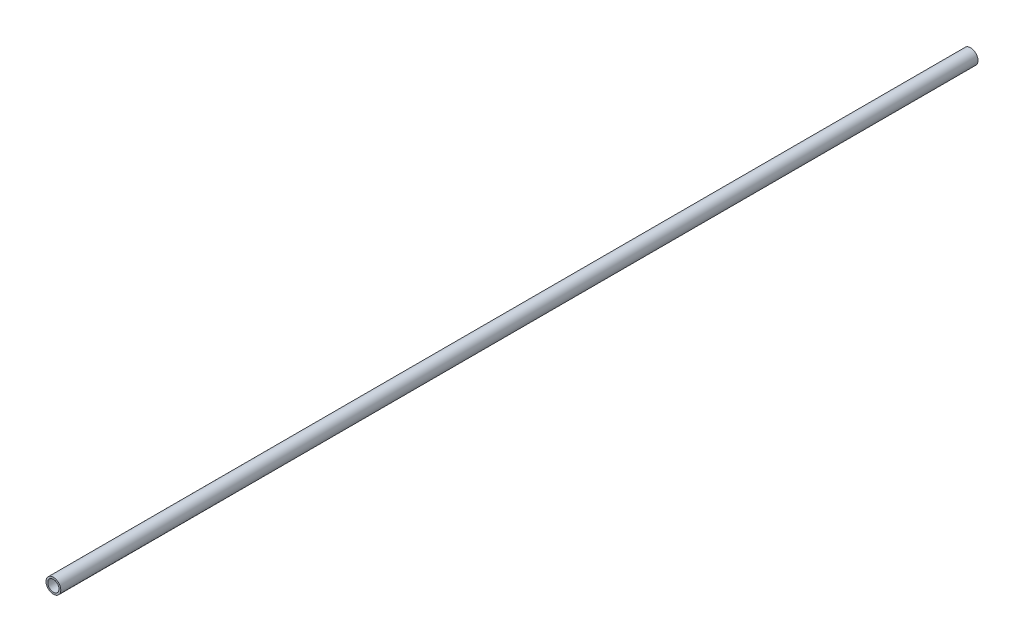
ISO-10303-21;
HEADER;
FILE_DESCRIPTION(('STEP AP214'),'2;1');
FILE_NAME('part.step','',(''),(''),'','','');
FILE_SCHEMA(('AUTOMOTIVE_DESIGN { 1 0 10303 214 1 1 1 1 }'));
ENDSEC;
DATA;
#1=APPLICATION_CONTEXT('core data for automotive mechanical design processes');
#2=APPLICATION_PROTOCOL_DEFINITION('international standard','automotive_design',2000,#1);
#3=PRODUCT_CONTEXT('',#1,'mechanical');
#4=PRODUCT('Part','Part','',(#3));
#5=PRODUCT_RELATED_PRODUCT_CATEGORY('part','',(#4));
#6=PRODUCT_DEFINITION_FORMATION('','',#4);
#7=PRODUCT_DEFINITION_CONTEXT('part definition',#1,'design');
#8=PRODUCT_DEFINITION('design','',#6,#7);
#9=PRODUCT_DEFINITION_SHAPE('','',#8);
#10=(LENGTH_UNIT() NAMED_UNIT(*) SI_UNIT(.MILLI.,.METRE.));
#11=(NAMED_UNIT(*) PLANE_ANGLE_UNIT() SI_UNIT($,.RADIAN.));
#12=(NAMED_UNIT(*) SI_UNIT($,.STERADIAN.) SOLID_ANGLE_UNIT());
#13=UNCERTAINTY_MEASURE_WITH_UNIT(LENGTH_MEASURE(1.E-05),#10,'distance_accuracy_value','');
#14=(GEOMETRIC_REPRESENTATION_CONTEXT(3) GLOBAL_UNCERTAINTY_ASSIGNED_CONTEXT((#13)) GLOBAL_UNIT_ASSIGNED_CONTEXT((#10,
#11,#12)) REPRESENTATION_CONTEXT('',''));
#15=CARTESIAN_POINT('',(0.,0.,0.));
#16=DIRECTION('',(0.,0.,1.));
#17=DIRECTION('',(1.,0.,0.));
#18=AXIS2_PLACEMENT_3D('',#15,#16,#17);
#19=CARTESIAN_POINT('',(0.,0.,2072.386));
#20=DIRECTION('',(0.,0.,1.));
#21=DIRECTION('',(1.,0.,0.));
#22=AXIS2_PLACEMENT_3D('',#19,#20,#21);
#23=PLANE('',#22);
#24=CARTESIAN_POINT('',(0.,0.,2072.386));
#25=DIRECTION('',(0.,0.,1.));
#26=DIRECTION('',(1.,0.,0.));
#27=AXIS2_PLACEMENT_3D('',#24,#25,#26);
#28=CIRCLE('',#27,16.7005);
#29=CARTESIAN_POINT('',(16.7005,0.,2072.386));
#30=VERTEX_POINT('',#29);
#31=EDGE_CURVE('E10',#30,#30,#28,.T.);
#32=ORIENTED_EDGE('',*,*,#31,.T.);
#33=EDGE_LOOP('',(#32));
#34=FACE_BOUND('',#33,.T.);
#35=CARTESIAN_POINT('',(0.,0.,2072.386));
#36=DIRECTION('',(0.,0.,1.));
#37=DIRECTION('',(1.,0.,0.));
#38=AXIS2_PLACEMENT_3D('',#35,#36,#37);
#39=CIRCLE('',#38,12.7);
#40=CARTESIAN_POINT('',(12.7,0.,2072.386));
#41=VERTEX_POINT('',#40);
#42=EDGE_CURVE('E44',#41,#41,#39,.T.);
#43=ORIENTED_EDGE('',*,*,#42,.F.);
#44=EDGE_LOOP('',(#43));
#45=FACE_BOUND('',#44,.T.);
#46=ADVANCED_FACE('F33',(#34,#45),#23,.T.);
#47=CARTESIAN_POINT('',(0.,0.,0.));
#48=DIRECTION('',(0.,0.,1.));
#49=DIRECTION('',(1.,0.,0.));
#50=AXIS2_PLACEMENT_3D('',#47,#48,#49);
#51=PLANE('',#50);
#52=CARTESIAN_POINT('',(0.,0.,0.));
#53=DIRECTION('',(0.,0.,1.));
#54=DIRECTION('',(1.,0.,0.));
#55=AXIS2_PLACEMENT_3D('',#52,#53,#54);
#56=CIRCLE('',#55,16.7005);
#57=CARTESIAN_POINT('',(16.7005,0.,0.));
#58=VERTEX_POINT('',#57);
#59=EDGE_CURVE('E37',#58,#58,#56,.T.);
#60=ORIENTED_EDGE('',*,*,#59,.F.);
#61=EDGE_LOOP('',(#60));
#62=FACE_BOUND('',#61,.T.);
#63=CARTESIAN_POINT('',(0.,0.,0.));
#64=DIRECTION('',(0.,0.,1.));
#65=DIRECTION('',(1.,0.,0.));
#66=AXIS2_PLACEMENT_3D('',#63,#64,#65);
#67=CIRCLE('',#66,12.7);
#68=CARTESIAN_POINT('',(12.7,0.,0.));
#69=VERTEX_POINT('',#68);
#70=EDGE_CURVE('E46',#69,#69,#67,.T.);
#71=ORIENTED_EDGE('',*,*,#70,.T.);
#72=EDGE_LOOP('',(#71));
#73=FACE_BOUND('',#72,.T.);
#74=ADVANCED_FACE('F56',(#62,#73),#51,.F.);
#75=CARTESIAN_POINT('',(0.,0.,2072.386));
#76=DIRECTION('',(0.,0.,-1.));
#77=DIRECTION('',(-1.,0.,0.));
#78=AXIS2_PLACEMENT_3D('',#75,#76,#77);
#79=CYLINDRICAL_SURFACE('',#78,16.7005);
#80=ORIENTED_EDGE('',*,*,#31,.F.);
#81=EDGE_LOOP('',(#80));
#82=FACE_BOUND('',#81,.T.);
#83=ORIENTED_EDGE('',*,*,#59,.T.);
#84=EDGE_LOOP('',(#83));
#85=FACE_BOUND('',#84,.T.);
#86=ADVANCED_FACE('F35',(#82,#85),#79,.T.);
#87=CARTESIAN_POINT('',(0.,0.,2072.386));
#88=DIRECTION('',(0.,0.,-1.));
#89=DIRECTION('',(-1.,0.,0.));
#90=AXIS2_PLACEMENT_3D('',#87,#88,#89);
#91=CYLINDRICAL_SURFACE('',#90,12.7);
#92=ORIENTED_EDGE('',*,*,#42,.T.);
#93=EDGE_LOOP('',(#92));
#94=FACE_BOUND('',#93,.T.);
#95=ORIENTED_EDGE('',*,*,#70,.F.);
#96=EDGE_LOOP('',(#95));
#97=FACE_BOUND('',#96,.T.);
#98=ADVANCED_FACE('F52',(#94,#97),#91,.F.);
#99=CLOSED_SHELL('',(#46,#74,#86,#98));
#100=MANIFOLD_SOLID_BREP('B2',#99);
#101=ADVANCED_BREP_SHAPE_REPRESENTATION('',(#18,#100),#14);
#102=SHAPE_DEFINITION_REPRESENTATION(#9,#101);
ENDSEC;
END-ISO-10303-21;
